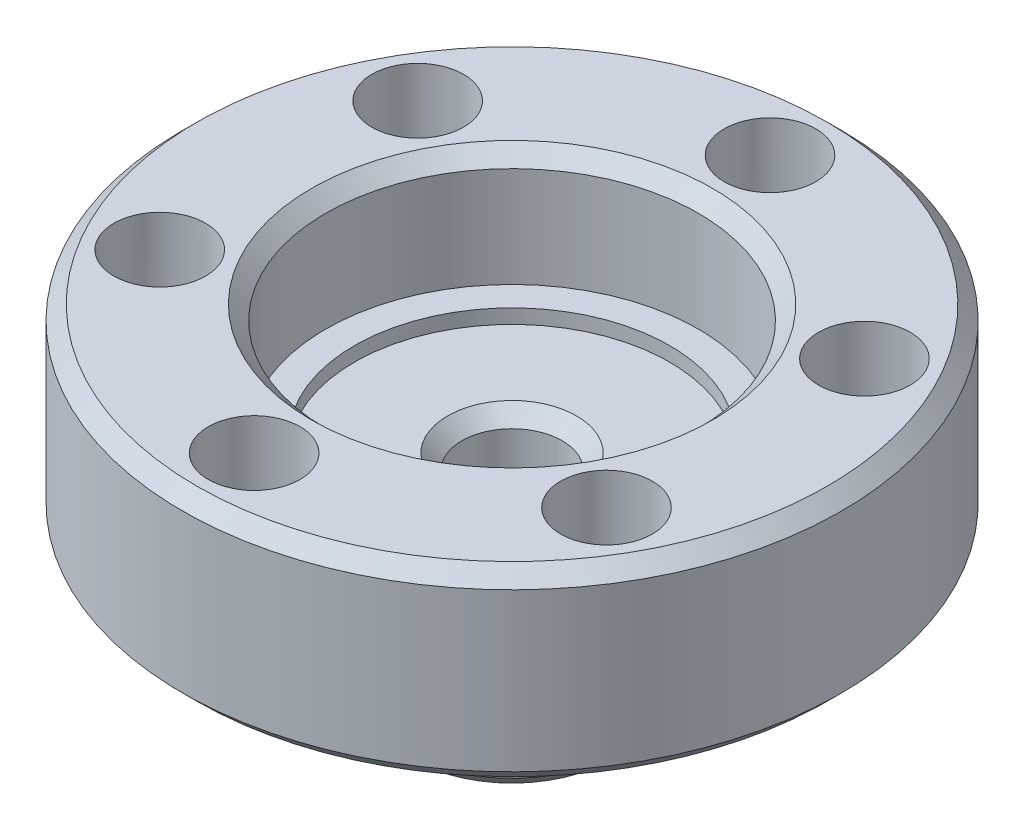
ISO-10303-21;
HEADER;
FILE_DESCRIPTION(('STEP AP214'),'2;1');
FILE_NAME('part.step','',(''),(''),'','','');
FILE_SCHEMA(('AUTOMOTIVE_DESIGN { 1 0 10303 214 1 1 1 1 }'));
ENDSEC;
DATA;
#1=APPLICATION_CONTEXT('core data for automotive mechanical design processes');
#2=APPLICATION_PROTOCOL_DEFINITION('international standard','automotive_design',2000,#1);
#3=PRODUCT_CONTEXT('',#1,'mechanical');
#4=PRODUCT('Part','Part','',(#3));
#5=PRODUCT_RELATED_PRODUCT_CATEGORY('part','',(#4));
#6=PRODUCT_DEFINITION_FORMATION('','',#4);
#7=PRODUCT_DEFINITION_CONTEXT('part definition',#1,'design');
#8=PRODUCT_DEFINITION('design','',#6,#7);
#9=PRODUCT_DEFINITION_SHAPE('','',#8);
#10=(LENGTH_UNIT() NAMED_UNIT(*) SI_UNIT(.MILLI.,.METRE.));
#11=(NAMED_UNIT(*) PLANE_ANGLE_UNIT() SI_UNIT($,.RADIAN.));
#12=(NAMED_UNIT(*) SI_UNIT($,.STERADIAN.) SOLID_ANGLE_UNIT());
#13=UNCERTAINTY_MEASURE_WITH_UNIT(LENGTH_MEASURE(1.E-05),#10,'distance_accuracy_value','');
#14=(GEOMETRIC_REPRESENTATION_CONTEXT(3) GLOBAL_UNCERTAINTY_ASSIGNED_CONTEXT((#13)) GLOBAL_UNIT_ASSIGNED_CONTEXT((#10,
#11,#12)) REPRESENTATION_CONTEXT('',''));
#15=CARTESIAN_POINT('',(0.,0.,0.));
#16=DIRECTION('',(0.,0.,1.));
#17=DIRECTION('',(1.,0.,0.));
#18=AXIS2_PLACEMENT_3D('',#15,#16,#17);
#19=CARTESIAN_POINT('',(7.79422863405996,-4.52548339959391,-4.49999999999998));
#20=DIRECTION('',(0.,1.,0.));
#21=DIRECTION('',(0.,0.,1.));
#22=AXIS2_PLACEMENT_3D('',#19,#20,#21);
#23=CYLINDRICAL_SURFACE('',#22,1.6);
#24=CARTESIAN_POINT('',(7.79422863405996,6.5,-4.49999999999998));
#25=DIRECTION('',(0.,1.,0.));
#26=DIRECTION('',(-0.86602540378444,0.,0.499999999999998));
#27=AXIS2_PLACEMENT_3D('',#24,#25,#26);
#28=CIRCLE('',#27,1.6);
#29=CARTESIAN_POINT('',(6.40858798800485,6.5,-3.69999999999998));
#30=VERTEX_POINT('',#29);
#31=EDGE_CURVE('E112',#30,#30,#28,.T.);
#32=ORIENTED_EDGE('',*,*,#31,.T.);
#33=EDGE_LOOP('',(#32));
#34=FACE_BOUND('',#33,.T.);
#35=CARTESIAN_POINT('',(7.79422863405996,4.,-4.49999999999998));
#36=DIRECTION('',(0.,-1.,0.));
#37=DIRECTION('',(0.,0.,-1.));
#38=AXIS2_PLACEMENT_3D('',#35,#36,#37);
#39=CIRCLE('',#38,1.6);
#40=CARTESIAN_POINT('',(7.79422863405996,4.,-6.09999999999998));
#41=VERTEX_POINT('',#40);
#42=EDGE_CURVE('E122',#41,#41,#39,.F.);
#43=ORIENTED_EDGE('',*,*,#42,.F.);
#44=EDGE_LOOP('',(#43));
#45=FACE_BOUND('',#44,.T.);
#46=ADVANCED_FACE('F45',(#34,#45),#23,.F.);
#47=CARTESIAN_POINT('',(7.79422863405993,-4.52548339959391,4.50000000000004));
#48=DIRECTION('',(0.,1.,0.));
#49=DIRECTION('',(0.,0.,1.));
#50=AXIS2_PLACEMENT_3D('',#47,#48,#49);
#51=CYLINDRICAL_SURFACE('',#50,1.6);
#52=CARTESIAN_POINT('',(7.79422863405993,6.5,4.50000000000004));
#53=DIRECTION('',(0.,1.,0.));
#54=DIRECTION('',(-0.866025403784436,0.,-0.500000000000004));
#55=AXIS2_PLACEMENT_3D('',#52,#53,#54);
#56=CIRCLE('',#55,1.6);
#57=CARTESIAN_POINT('',(6.40858798800483,6.5,3.70000000000003));
#58=VERTEX_POINT('',#57);
#59=EDGE_CURVE('E109',#58,#58,#56,.T.);
#60=ORIENTED_EDGE('',*,*,#59,.T.);
#61=EDGE_LOOP('',(#60));
#62=FACE_BOUND('',#61,.T.);
#63=CARTESIAN_POINT('',(7.79422863405993,4.,4.50000000000004));
#64=DIRECTION('',(0.,-1.,0.));
#65=DIRECTION('',(0.,0.,-1.));
#66=AXIS2_PLACEMENT_3D('',#63,#64,#65);
#67=CIRCLE('',#66,1.6);
#68=CARTESIAN_POINT('',(7.79422863405993,4.,2.90000000000004));
#69=VERTEX_POINT('',#68);
#70=EDGE_CURVE('E163',#69,#69,#67,.F.);
#71=ORIENTED_EDGE('',*,*,#70,.F.);
#72=EDGE_LOOP('',(#71));
#73=FACE_BOUND('',#72,.T.);
#74=ADVANCED_FACE('F220',(#62,#73),#51,.F.);
#75=CARTESIAN_POINT('',(0.,-4.52548339959391,9.));
#76=DIRECTION('',(0.,1.,0.));
#77=DIRECTION('',(0.,0.,1.));
#78=AXIS2_PLACEMENT_3D('',#75,#76,#77);
#79=CYLINDRICAL_SURFACE('',#78,1.6);
#80=CARTESIAN_POINT('',(0.,6.5,9.));
#81=DIRECTION('',(0.,1.,0.));
#82=DIRECTION('',(0.,0.,-1.));
#83=AXIS2_PLACEMENT_3D('',#80,#81,#82);
#84=CIRCLE('',#83,1.6);
#85=CARTESIAN_POINT('',(0.,6.5,7.4));
#86=VERTEX_POINT('',#85);
#87=EDGE_CURVE('E113',#86,#86,#84,.T.);
#88=ORIENTED_EDGE('',*,*,#87,.T.);
#89=EDGE_LOOP('',(#88));
#90=FACE_BOUND('',#89,.T.);
#91=CARTESIAN_POINT('',(0.,4.,9.));
#92=DIRECTION('',(0.,-1.,0.));
#93=DIRECTION('',(0.,0.,-1.));
#94=AXIS2_PLACEMENT_3D('',#91,#92,#93);
#95=CIRCLE('',#94,1.6);
#96=CARTESIAN_POINT('',(0.,4.,7.4));
#97=VERTEX_POINT('',#96);
#98=EDGE_CURVE('E160',#97,#97,#95,.F.);
#99=ORIENTED_EDGE('',*,*,#98,.F.);
#100=EDGE_LOOP('',(#99));
#101=FACE_BOUND('',#100,.T.);
#102=ADVANCED_FACE('F227',(#90,#101),#79,.F.);
#103=CARTESIAN_POINT('',(-7.79422863405999,-4.52548339959391,4.49999999999993));
#104=DIRECTION('',(0.,1.,0.));
#105=DIRECTION('',(0.,0.,1.));
#106=AXIS2_PLACEMENT_3D('',#103,#104,#105);
#107=CYLINDRICAL_SURFACE('',#106,1.6);
#108=CARTESIAN_POINT('',(-7.79422863405999,6.5,4.49999999999993));
#109=DIRECTION('',(0.,1.,0.));
#110=DIRECTION('',(0.866025403784443,0.,-0.499999999999992));
#111=AXIS2_PLACEMENT_3D('',#108,#109,#110);
#112=CIRCLE('',#111,1.6);
#113=CARTESIAN_POINT('',(-6.40858798800488,6.5,3.69999999999994));
#114=VERTEX_POINT('',#113);
#115=EDGE_CURVE('E116',#114,#114,#112,.T.);
#116=ORIENTED_EDGE('',*,*,#115,.T.);
#117=EDGE_LOOP('',(#116));
#118=FACE_BOUND('',#117,.T.);
#119=CARTESIAN_POINT('',(-7.79422863405999,4.,4.49999999999993));
#120=DIRECTION('',(0.,-1.,0.));
#121=DIRECTION('',(0.,0.,-1.));
#122=AXIS2_PLACEMENT_3D('',#119,#120,#121);
#123=CIRCLE('',#122,1.6);
#124=CARTESIAN_POINT('',(-7.79422863405999,4.,2.89999999999993));
#125=VERTEX_POINT('',#124);
#126=EDGE_CURVE('E157',#125,#125,#123,.F.);
#127=ORIENTED_EDGE('',*,*,#126,.F.);
#128=EDGE_LOOP('',(#127));
#129=FACE_BOUND('',#128,.T.);
#130=ADVANCED_FACE('F463',(#118,#129),#107,.F.);
#131=CARTESIAN_POINT('',(-7.79422863405989,-4.52548339959391,-4.50000000000009));
#132=DIRECTION('',(0.,1.,0.));
#133=DIRECTION('',(0.,0.,1.));
#134=AXIS2_PLACEMENT_3D('',#131,#132,#133);
#135=CYLINDRICAL_SURFACE('',#134,1.6);
#136=CARTESIAN_POINT('',(-7.79422863405989,6.5,-4.50000000000009));
#137=DIRECTION('',(0.,1.,0.));
#138=DIRECTION('',(0.866025403784433,0.,0.50000000000001));
#139=AXIS2_PLACEMENT_3D('',#136,#137,#138);
#140=CIRCLE('',#139,1.6);
#141=CARTESIAN_POINT('',(-6.4085879880048,6.5,-3.70000000000007));
#142=VERTEX_POINT('',#141);
#143=EDGE_CURVE('E119',#142,#142,#140,.T.);
#144=ORIENTED_EDGE('',*,*,#143,.T.);
#145=EDGE_LOOP('',(#144));
#146=FACE_BOUND('',#145,.T.);
#147=CARTESIAN_POINT('',(-7.79422863405989,4.,-4.50000000000009));
#148=DIRECTION('',(0.,-1.,0.));
#149=DIRECTION('',(0.,0.,-1.));
#150=AXIS2_PLACEMENT_3D('',#147,#148,#149);
#151=CIRCLE('',#150,1.6);
#152=CARTESIAN_POINT('',(-7.79422863405989,4.,-6.10000000000009));
#153=VERTEX_POINT('',#152);
#154=EDGE_CURVE('E105',#153,#153,#151,.F.);
#155=ORIENTED_EDGE('',*,*,#154,.F.);
#156=EDGE_LOOP('',(#155));
#157=FACE_BOUND('',#156,.T.);
#158=ADVANCED_FACE('F233',(#146,#157),#135,.F.);
#159=CARTESIAN_POINT('',(0.,-4.52548339959391,-9.));
#160=DIRECTION('',(0.,1.,0.));
#161=DIRECTION('',(0.,0.,1.));
#162=AXIS2_PLACEMENT_3D('',#159,#160,#161);
#163=CYLINDRICAL_SURFACE('',#162,1.6);
#164=CARTESIAN_POINT('',(0.,6.5,-9.));
#165=DIRECTION('',(0.,1.,0.));
#166=DIRECTION('',(0.,0.,1.));
#167=AXIS2_PLACEMENT_3D('',#164,#165,#166);
#168=CIRCLE('',#167,1.6);
#169=CARTESIAN_POINT('',(0.,6.5,-7.4));
#170=VERTEX_POINT('',#169);
#171=EDGE_CURVE('E131',#170,#170,#168,.T.);
#172=ORIENTED_EDGE('',*,*,#171,.T.);
#173=EDGE_LOOP('',(#172));
#174=FACE_BOUND('',#173,.T.);
#175=CARTESIAN_POINT('',(0.,4.,-9.));
#176=DIRECTION('',(0.,-1.,0.));
#177=DIRECTION('',(0.,0.,-1.));
#178=AXIS2_PLACEMENT_3D('',#175,#176,#177);
#179=CIRCLE('',#178,1.6);
#180=CARTESIAN_POINT('',(0.,4.,-10.6));
#181=VERTEX_POINT('',#180);
#182=EDGE_CURVE('E129',#181,#181,#179,.F.);
#183=ORIENTED_EDGE('',*,*,#182,.F.);
#184=EDGE_LOOP('',(#183));
#185=FACE_BOUND('',#184,.T.);
#186=ADVANCED_FACE('F244',(#174,#185),#163,.F.);
#187=CARTESIAN_POINT('',(0.,6.5,0.));
#188=DIRECTION('',(0.,-1.,0.));
#189=DIRECTION('',(0.,0.,-1.));
#190=AXIS2_PLACEMENT_3D('',#187,#188,#189);
#191=CYLINDRICAL_SURFACE('',#190,11.5);
#192=CARTESIAN_POINT('',(0.,0.500000000000025,0.));
#193=DIRECTION('',(0.,1.,0.));
#194=DIRECTION('',(0.,0.,1.));
#195=AXIS2_PLACEMENT_3D('',#192,#193,#194);
#196=CIRCLE('',#195,11.5);
#197=CARTESIAN_POINT('',(0.,0.500000000000025,-11.5));
#198=VERTEX_POINT('',#197);
#199=EDGE_CURVE('E188',#198,#198,#196,.T.);
#200=CARTESIAN_POINT('',(0.,6.00000000000003,0.));
#201=DIRECTION('',(0.,1.,0.));
#202=DIRECTION('',(0.,0.,1.));
#203=AXIS2_PLACEMENT_3D('',#200,#201,#202);
#204=CIRCLE('',#203,11.5);
#205=CARTESIAN_POINT('',(0.,6.00000000000003,-11.5));
#206=VERTEX_POINT('',#205);
#207=EDGE_CURVE('E185',#206,#206,#204,.F.);
#208=CARTESIAN_POINT('',(0.,0.500000000000025,-11.5));
#209=CARTESIAN_POINT('',(0.,0.557291666666691,-11.5));
#210=CARTESIAN_POINT('',(0.,0.614583333333358,-11.5));
#211=CARTESIAN_POINT('',(0.,0.729166666666691,-11.5));
#212=CARTESIAN_POINT('',(0.,0.786458333333358,-11.5));
#213=CARTESIAN_POINT('',(0.,0.901041666666692,-11.5));
#214=CARTESIAN_POINT('',(0.,0.958333333333358,-11.5));
#215=CARTESIAN_POINT('',(0.,1.07291666666669,-11.5));
#216=CARTESIAN_POINT('',(0.,1.13020833333336,-11.5));
#217=CARTESIAN_POINT('',(0.,1.24479166666669,-11.5));
#218=CARTESIAN_POINT('',(0.,1.30208333333336,-11.5));
#219=CARTESIAN_POINT('',(0.,1.41666666666669,-11.5));
#220=CARTESIAN_POINT('',(0.,1.47395833333336,-11.5));
#221=CARTESIAN_POINT('',(0.,1.58854166666669,-11.5));
#222=CARTESIAN_POINT('',(0.,1.64583333333336,-11.5));
#223=CARTESIAN_POINT('',(0.,1.76041666666669,-11.5));
#224=CARTESIAN_POINT('',(0.,1.81770833333336,-11.5));
#225=CARTESIAN_POINT('',(0.,1.93229166666669,-11.5));
#226=CARTESIAN_POINT('',(0.,1.98958333333336,-11.5));
#227=CARTESIAN_POINT('',(0.,2.10416666666669,-11.5));
#228=CARTESIAN_POINT('',(0.,2.16145833333336,-11.5));
#229=CARTESIAN_POINT('',(0.,2.27604166666669,-11.5));
#230=CARTESIAN_POINT('',(0.,2.33333333333336,-11.5));
#231=CARTESIAN_POINT('',(0.,2.44791666666669,-11.5));
#232=CARTESIAN_POINT('',(0.,2.50520833333336,-11.5));
#233=CARTESIAN_POINT('',(0.,2.61979166666669,-11.5));
#234=CARTESIAN_POINT('',(0.,2.67708333333336,-11.5));
#235=CARTESIAN_POINT('',(0.,2.79166666666669,-11.5));
#236=CARTESIAN_POINT('',(0.,2.84895833333336,-11.5));
#237=CARTESIAN_POINT('',(0.,2.96354166666669,-11.5));
#238=CARTESIAN_POINT('',(0.,3.02083333333336,-11.5));
#239=CARTESIAN_POINT('',(0.,3.13541666666669,-11.5));
#240=CARTESIAN_POINT('',(0.,3.19270833333336,-11.5));
#241=CARTESIAN_POINT('',(0.,3.30729166666669,-11.5));
#242=CARTESIAN_POINT('',(0.,3.36458333333336,-11.5));
#243=CARTESIAN_POINT('',(0.,3.47916666666669,-11.5));
#244=CARTESIAN_POINT('',(0.,3.53645833333336,-11.5));
#245=CARTESIAN_POINT('',(0.,3.65104166666669,-11.5));
#246=CARTESIAN_POINT('',(0.,3.70833333333336,-11.5));
#247=CARTESIAN_POINT('',(0.,3.82291666666669,-11.5));
#248=CARTESIAN_POINT('',(0.,3.88020833333336,-11.5));
#249=CARTESIAN_POINT('',(0.,3.99479166666669,-11.5));
#250=CARTESIAN_POINT('',(0.,4.05208333333336,-11.5));
#251=CARTESIAN_POINT('',(0.,4.16666666666669,-11.5));
#252=CARTESIAN_POINT('',(0.,4.22395833333336,-11.5));
#253=CARTESIAN_POINT('',(0.,4.33854166666669,-11.5));
#254=CARTESIAN_POINT('',(0.,4.39583333333336,-11.5));
#255=CARTESIAN_POINT('',(0.,4.51041666666669,-11.5));
#256=CARTESIAN_POINT('',(0.,4.56770833333336,-11.5));
#257=CARTESIAN_POINT('',(0.,4.68229166666669,-11.5));
#258=CARTESIAN_POINT('',(0.,4.73958333333336,-11.5));
#259=CARTESIAN_POINT('',(0.,4.85416666666669,-11.5));
#260=CARTESIAN_POINT('',(0.,4.91145833333336,-11.5));
#261=CARTESIAN_POINT('',(0.,5.02604166666669,-11.5));
#262=CARTESIAN_POINT('',(0.,5.08333333333336,-11.5));
#263=CARTESIAN_POINT('',(0.,5.19791666666669,-11.5));
#264=CARTESIAN_POINT('',(0.,5.25520833333336,-11.5));
#265=CARTESIAN_POINT('',(0.,5.36979166666669,-11.5));
#266=CARTESIAN_POINT('',(0.,5.42708333333336,-11.5));
#267=CARTESIAN_POINT('',(0.,5.54166666666669,-11.5));
#268=CARTESIAN_POINT('',(0.,5.59895833333336,-11.5));
#269=CARTESIAN_POINT('',(0.,5.71354166666669,-11.5));
#270=CARTESIAN_POINT('',(0.,5.77083333333336,-11.5));
#271=CARTESIAN_POINT('',(0.,5.88541666666669,-11.5));
#272=CARTESIAN_POINT('',(0.,5.94270833333336,-11.5));
#273=CARTESIAN_POINT('',(0.,6.00000000000003,-11.5));
#274=B_SPLINE_CURVE_WITH_KNOTS('',3,(#208,#209,#210,#211,#212,#213,#214,#215,#216,#217,#218,
#219,#220,#221,#222,#223,#224,#225,#226,#227,#228,#229,#230,#231,#232,#233,#234,#235,#236,#237,
#238,#239,#240,#241,#242,#243,#244,#245,#246,#247,#248,#249,#250,#251,#252,#253,#254,#255,#256,
#257,#258,#259,#260,#261,#262,#263,#264,#265,#266,#267,#268,#269,#270,#271,#272,#273),
.UNSPECIFIED.,.F.,.F.,(4,2,2,2,2,2,2,2,2,2,2,2,2,2,2,2,2,2,2,2,2,2,2,2,2,2,2,2,2,2,2,2,4),(0.,
0.171875,0.34375,0.515625,0.687500000000001,0.859375000000001,1.03125,1.203125,1.375,1.546875,
1.71875,1.890625,2.0625,2.234375,2.40625,2.578125,2.75,2.921875,3.09375,3.265625,3.4375,
3.609375,3.78125,3.953125,4.125,4.296875,4.46875,4.640625,4.8125,4.984375,5.15625,5.328125,5.5),.UNSPECIFIED.);
#275=EDGE_CURVE('BSEAM247',#198,#206,#274,.T.);
#276=ORIENTED_EDGE('',*,*,#199,.T.);
#277=ORIENTED_EDGE('',*,*,#207,.T.);
#278=ORIENTED_EDGE('',*,*,#275,.T.);
#279=ORIENTED_EDGE('',*,*,#275,.F.);
#280=EDGE_LOOP('',(#276,#278,#277,#279));
#281=FACE_BOUND('',#280,.T.);
#282=ADVANCED_FACE('F247',(#281),#191,.T.);
#283=CARTESIAN_POINT('',(0.,6.5,0.));
#284=DIRECTION('',(0.,1.,0.));
#285=DIRECTION('',(0.,0.,1.));
#286=AXIS2_PLACEMENT_3D('',#283,#284,#285);
#287=PLANE('',#286);
#288=CARTESIAN_POINT('',(0.,6.5,0.));
#289=DIRECTION('',(0.,1.,0.));
#290=DIRECTION('',(0.,0.,1.));
#291=AXIS2_PLACEMENT_3D('',#288,#289,#290);
#292=CIRCLE('',#291,11.);
#293=CARTESIAN_POINT('',(0.,6.5,11.));
#294=VERTEX_POINT('',#293);
#295=EDGE_CURVE('E54',#294,#294,#292,.T.);
#296=ORIENTED_EDGE('',*,*,#295,.T.);
#297=EDGE_LOOP('',(#296));
#298=FACE_BOUND('',#297,.T.);
#299=CARTESIAN_POINT('',(0.,6.5,0.));
#300=DIRECTION('',(0.,1.,0.));
#301=DIRECTION('',(0.,0.,1.));
#302=AXIS2_PLACEMENT_3D('',#299,#300,#301);
#303=CIRCLE('',#302,7.00000000000001);
#304=CARTESIAN_POINT('',(0.,6.5,7.00000000000001));
#305=VERTEX_POINT('',#304);
#306=EDGE_CURVE('E198',#305,#305,#303,.F.);
#307=ORIENTED_EDGE('',*,*,#306,.T.);
#308=EDGE_LOOP('',(#307));
#309=FACE_BOUND('',#308,.T.);
#310=ORIENTED_EDGE('',*,*,#143,.F.);
#311=EDGE_LOOP('',(#310));
#312=FACE_BOUND('',#311,.T.);
#313=ORIENTED_EDGE('',*,*,#115,.F.);
#314=EDGE_LOOP('',(#313));
#315=FACE_BOUND('',#314,.T.);
#316=ORIENTED_EDGE('',*,*,#87,.F.);
#317=EDGE_LOOP('',(#316));
#318=FACE_BOUND('',#317,.T.);
#319=ORIENTED_EDGE('',*,*,#59,.F.);
#320=EDGE_LOOP('',(#319));
#321=FACE_BOUND('',#320,.T.);
#322=ORIENTED_EDGE('',*,*,#31,.F.);
#323=EDGE_LOOP('',(#322));
#324=FACE_BOUND('',#323,.T.);
#325=ORIENTED_EDGE('',*,*,#171,.F.);
#326=EDGE_LOOP('',(#325));
#327=FACE_BOUND('',#326,.T.);
#328=ADVANCED_FACE('F203',(#298,#309,#312,#315,#318,#321,#324,#327),#287,.T.);
#329=CARTESIAN_POINT('',(0.,0.,0.));
#330=DIRECTION('',(0.,1.,0.));
#331=DIRECTION('',(0.,0.,1.));
#332=AXIS2_PLACEMENT_3D('',#329,#330,#331);
#333=PLANE('',#332);
#334=CARTESIAN_POINT('',(0.,0.,9.));
#335=DIRECTION('',(0.,-1.,0.));
#336=DIRECTION('',(0.,0.,1.));
#337=AXIS2_PLACEMENT_3D('',#334,#335,#336);
#338=CIRCLE('',#337,2.);
#339=CARTESIAN_POINT('',(0.,0.,11.));
#340=VERTEX_POINT('',#339);
#341=EDGE_CURVE('E616',#340,#340,#338,.T.);
#342=ORIENTED_EDGE('',*,*,#341,.F.);
#343=CARTESIAN_POINT('',(0.,0.,0.));
#344=DIRECTION('',(0.,1.,0.));
#345=DIRECTION('',(0.,0.,1.));
#346=AXIS2_PLACEMENT_3D('',#343,#344,#345);
#347=CIRCLE('',#346,11.);
#348=CARTESIAN_POINT('',(-9.52627944162887,0.,5.49999999999991));
#349=VERTEX_POINT('',#348);
#350=EDGE_CURVE('E92',#340,#349,#347,.F.);
#351=ORIENTED_EDGE('',*,*,#350,.T.);
#352=CARTESIAN_POINT('',(-7.79422863405999,0.,4.49999999999993));
#353=DIRECTION('',(0.,-1.,0.));
#354=DIRECTION('',(-0.866025403784443,0.,0.499999999999992));
#355=AXIS2_PLACEMENT_3D('',#352,#353,#354);
#356=CIRCLE('',#355,2.);
#357=EDGE_CURVE('E89',#349,#349,#356,.T.);
#358=ORIENTED_EDGE('',*,*,#357,.F.);
#359=CARTESIAN_POINT('',(0.,0.,0.));
#360=DIRECTION('',(0.,1.,0.));
#361=DIRECTION('',(0.,0.,1.));
#362=AXIS2_PLACEMENT_3D('',#359,#360,#361);
#363=CIRCLE('',#362,11.);
#364=CARTESIAN_POINT('',(-9.52627944162876,0.,-5.50000000000011));
#365=VERTEX_POINT('',#364);
#366=EDGE_CURVE('E81',#349,#365,#363,.F.);
#367=ORIENTED_EDGE('',*,*,#366,.T.);
#368=CARTESIAN_POINT('',(-7.79422863405989,0.,-4.50000000000009));
#369=DIRECTION('',(0.,-1.,0.));
#370=DIRECTION('',(-0.866025403784433,0.,-0.50000000000001));
#371=AXIS2_PLACEMENT_3D('',#368,#369,#370);
#372=CIRCLE('',#371,2.);
#373=EDGE_CURVE('E86',#365,#365,#372,.T.);
#374=ORIENTED_EDGE('',*,*,#373,.F.);
#375=CARTESIAN_POINT('',(0.,0.,0.));
#376=DIRECTION('',(0.,1.,0.));
#377=DIRECTION('',(0.,0.,1.));
#378=AXIS2_PLACEMENT_3D('',#375,#376,#377);
#379=CIRCLE('',#378,11.);
#380=CARTESIAN_POINT('',(0.,0.,-11.));
#381=VERTEX_POINT('',#380);
#382=EDGE_CURVE('E61',#365,#381,#379,.F.);
#383=ORIENTED_EDGE('',*,*,#382,.T.);
#384=CARTESIAN_POINT('',(0.,0.,-9.));
#385=DIRECTION('',(0.,-1.,0.));
#386=DIRECTION('',(0.,0.,-1.));
#387=AXIS2_PLACEMENT_3D('',#384,#385,#386);
#388=CIRCLE('',#387,2.);
#389=EDGE_CURVE('E125',#381,#381,#388,.T.);
#390=ORIENTED_EDGE('',*,*,#389,.F.);
#391=CARTESIAN_POINT('',(0.,0.,0.));
#392=DIRECTION('',(0.,1.,0.));
#393=DIRECTION('',(0.,0.,1.));
#394=AXIS2_PLACEMENT_3D('',#391,#392,#393);
#395=CIRCLE('',#394,11.);
#396=CARTESIAN_POINT('',(9.52627944162884,0.,-5.49999999999998));
#397=VERTEX_POINT('',#396);
#398=EDGE_CURVE('E67',#381,#397,#395,.F.);
#399=ORIENTED_EDGE('',*,*,#398,.T.);
#400=CARTESIAN_POINT('',(7.79422863405996,0.,-4.49999999999998));
#401=DIRECTION('',(0.,-1.,0.));
#402=DIRECTION('',(0.86602540378444,0.,-0.499999999999998));
#403=AXIS2_PLACEMENT_3D('',#400,#401,#402);
#404=CIRCLE('',#403,2.);
#405=EDGE_CURVE('E106',#397,#397,#404,.T.);
#406=ORIENTED_EDGE('',*,*,#405,.F.);
#407=CARTESIAN_POINT('',(0.,0.,0.));
#408=DIRECTION('',(0.,1.,0.));
#409=DIRECTION('',(0.,0.,1.));
#410=AXIS2_PLACEMENT_3D('',#407,#408,#409);
#411=CIRCLE('',#410,11.);
#412=CARTESIAN_POINT('',(9.5262794416288,0.,5.50000000000004));
#413=VERTEX_POINT('',#412);
#414=EDGE_CURVE('E193',#397,#413,#411,.F.);
#415=ORIENTED_EDGE('',*,*,#414,.T.);
#416=CARTESIAN_POINT('',(7.79422863405993,0.,4.50000000000004));
#417=DIRECTION('',(0.,-1.,0.));
#418=DIRECTION('',(0.866025403784436,0.,0.500000000000004));
#419=AXIS2_PLACEMENT_3D('',#416,#417,#418);
#420=CIRCLE('',#419,2.);
#421=EDGE_CURVE('E624',#413,#413,#420,.T.);
#422=ORIENTED_EDGE('',*,*,#421,.F.);
#423=CARTESIAN_POINT('',(0.,0.,0.));
#424=DIRECTION('',(0.,1.,0.));
#425=DIRECTION('',(0.,0.,1.));
#426=AXIS2_PLACEMENT_3D('',#423,#424,#425);
#427=CIRCLE('',#426,11.);
#428=EDGE_CURVE('E191',#413,#340,#427,.F.);
#429=ORIENTED_EDGE('',*,*,#428,.T.);
#430=EDGE_LOOP('',(#342,#351,#358,#367,#374,#383,#390,#399,#406,#415,#422,#429));
#431=FACE_BOUND('',#430,.T.);
#432=CARTESIAN_POINT('',(0.,0.,0.));
#433=DIRECTION('',(0.,-1.,0.));
#434=DIRECTION('',(0.,0.,-1.));
#435=AXIS2_PLACEMENT_3D('',#432,#433,#434);
#436=CIRCLE('',#435,5.);
#437=CARTESIAN_POINT('',(0.,0.,-5.));
#438=VERTEX_POINT('',#437);
#439=EDGE_CURVE('E148',#438,#438,#436,.T.);
#440=ORIENTED_EDGE('',*,*,#439,.F.);
#441=EDGE_LOOP('',(#440));
#442=FACE_BOUND('',#441,.T.);
#443=ADVANCED_FACE('F84',(#431,#442),#333,.F.);
#444=CARTESIAN_POINT('',(0.,-0.5,0.));
#445=DIRECTION('',(0.,1.,0.));
#446=DIRECTION('',(0.,0.,1.));
#447=AXIS2_PLACEMENT_3D('',#444,#445,#446);
#448=CYLINDRICAL_SURFACE('',#447,5.);
#449=CARTESIAN_POINT('',(0.,-0.5,0.));
#450=DIRECTION('',(0.,-1.,0.));
#451=DIRECTION('',(0.,0.,-1.));
#452=AXIS2_PLACEMENT_3D('',#449,#450,#451);
#453=CIRCLE('',#452,5.);
#454=CARTESIAN_POINT('',(0.,-0.5,-5.));
#455=VERTEX_POINT('',#454);
#456=EDGE_CURVE('E143',#455,#455,#453,.T.);
#457=ORIENTED_EDGE('',*,*,#456,.F.);
#458=EDGE_LOOP('',(#457));
#459=FACE_BOUND('',#458,.T.);
#460=ORIENTED_EDGE('',*,*,#439,.T.);
#461=EDGE_LOOP('',(#460));
#462=FACE_BOUND('',#461,.T.);
#463=ADVANCED_FACE('F279',(#459,#462),#448,.T.);
#464=CARTESIAN_POINT('',(0.,-0.5,0.));
#465=DIRECTION('',(0.,-1.,0.));
#466=DIRECTION('',(0.,0.,-1.));
#467=AXIS2_PLACEMENT_3D('',#464,#465,#466);
#468=PLANE('',#467);
#469=CARTESIAN_POINT('',(0.,-0.5,0.));
#470=DIRECTION('',(0.,-1.,0.));
#471=DIRECTION('',(0.,0.,-1.));
#472=AXIS2_PLACEMENT_3D('',#469,#470,#471);
#473=CIRCLE('',#472,4.);
#474=CARTESIAN_POINT('',(0.,-0.5,-4.));
#475=VERTEX_POINT('',#474);
#476=EDGE_CURVE('E144',#475,#475,#473,.T.);
#477=ORIENTED_EDGE('',*,*,#476,.F.);
#478=EDGE_LOOP('',(#477));
#479=FACE_BOUND('',#478,.T.);
#480=ORIENTED_EDGE('',*,*,#456,.T.);
#481=EDGE_LOOP('',(#480));
#482=FACE_BOUND('',#481,.T.);
#483=ADVANCED_FACE('F275',(#479,#482),#468,.T.);
#484=CARTESIAN_POINT('',(0.,-5.5,0.));
#485=DIRECTION('',(0.,1.,0.));
#486=DIRECTION('',(0.,0.,1.));
#487=AXIS2_PLACEMENT_3D('',#484,#485,#486);
#488=CYLINDRICAL_SURFACE('',#487,4.);
#489=CARTESIAN_POINT('',(0.,-5.00000000000001,0.));
#490=DIRECTION('',(0.,-1.,0.));
#491=DIRECTION('',(0.,0.,-1.));
#492=AXIS2_PLACEMENT_3D('',#489,#490,#491);
#493=CIRCLE('',#492,4.);
#494=CARTESIAN_POINT('',(0.,-5.00000000000001,-4.));
#495=VERTEX_POINT('',#494);
#496=EDGE_CURVE('E182',#495,#495,#493,.F.);
#497=ORIENTED_EDGE('',*,*,#496,.T.);
#498=EDGE_LOOP('',(#497));
#499=FACE_BOUND('',#498,.T.);
#500=ORIENTED_EDGE('',*,*,#476,.T.);
#501=EDGE_LOOP('',(#500));
#502=FACE_BOUND('',#501,.T.);
#503=ADVANCED_FACE('F271',(#499,#502),#488,.T.);
#504=CARTESIAN_POINT('',(0.,-5.5,0.));
#505=DIRECTION('',(0.,-1.,0.));
#506=DIRECTION('',(0.,0.,-1.));
#507=AXIS2_PLACEMENT_3D('',#504,#505,#506);
#508=PLANE('',#507);
#509=CARTESIAN_POINT('',(0.,-5.5,0.));
#510=DIRECTION('',(0.,-1.,0.));
#511=DIRECTION('',(0.,0.,-1.));
#512=AXIS2_PLACEMENT_3D('',#509,#510,#511);
#513=CIRCLE('',#512,2.24999999999999);
#514=CARTESIAN_POINT('',(0.,-5.5,-2.24999999999999));
#515=VERTEX_POINT('',#514);
#516=EDGE_CURVE('E179',#515,#515,#513,.F.);
#517=ORIENTED_EDGE('',*,*,#516,.T.);
#518=EDGE_LOOP('',(#517));
#519=FACE_BOUND('',#518,.T.);
#520=CARTESIAN_POINT('',(0.,-5.5,0.));
#521=DIRECTION('',(0.,-1.,0.));
#522=DIRECTION('',(0.,0.,-1.));
#523=AXIS2_PLACEMENT_3D('',#520,#521,#522);
#524=CIRCLE('',#523,3.50000000000001);
#525=CARTESIAN_POINT('',(0.,-5.5,-3.50000000000001));
#526=VERTEX_POINT('',#525);
#527=EDGE_CURVE('E176',#526,#526,#524,.T.);
#528=ORIENTED_EDGE('',*,*,#527,.T.);
#529=EDGE_LOOP('',(#528));
#530=FACE_BOUND('',#529,.T.);
#531=ADVANCED_FACE('F267',(#519,#530),#508,.T.);
#532=CARTESIAN_POINT('',(0.,2.5,0.));
#533=DIRECTION('',(0.,1.,0.));
#534=DIRECTION('',(0.,0.,1.));
#535=AXIS2_PLACEMENT_3D('',#532,#533,#534);
#536=CYLINDRICAL_SURFACE('',#535,6.5);
#537=CARTESIAN_POINT('',(0.,6.,0.));
#538=DIRECTION('',(0.,1.,0.));
#539=DIRECTION('',(0.,0.,1.));
#540=AXIS2_PLACEMENT_3D('',#537,#538,#539);
#541=CIRCLE('',#540,6.5);
#542=CARTESIAN_POINT('',(0.,6.,6.5));
#543=VERTEX_POINT('',#542);
#544=EDGE_CURVE('E11',#543,#543,#541,.T.);
#545=ORIENTED_EDGE('',*,*,#544,.T.);
#546=EDGE_LOOP('',(#545));
#547=FACE_BOUND('',#546,.T.);
#548=CARTESIAN_POINT('',(0.,2.5,0.));
#549=DIRECTION('',(0.,1.,0.));
#550=DIRECTION('',(0.,0.,1.));
#551=AXIS2_PLACEMENT_3D('',#548,#549,#550);
#552=CIRCLE('',#551,6.5);
#553=CARTESIAN_POINT('',(0.,2.5,6.5));
#554=VERTEX_POINT('',#553);
#555=EDGE_CURVE('E138',#554,#554,#552,.T.);
#556=ORIENTED_EDGE('',*,*,#555,.F.);
#557=EDGE_LOOP('',(#556));
#558=FACE_BOUND('',#557,.T.);
#559=ADVANCED_FACE('F263',(#547,#558),#536,.F.);
#560=CARTESIAN_POINT('',(0.,2.5,0.));
#561=DIRECTION('',(0.,1.,0.));
#562=DIRECTION('',(0.,0.,1.));
#563=AXIS2_PLACEMENT_3D('',#560,#561,#562);
#564=PLANE('',#563);
#565=CARTESIAN_POINT('',(0.,2.5,0.));
#566=DIRECTION('',(0.,1.,0.));
#567=DIRECTION('',(0.,0.,1.));
#568=AXIS2_PLACEMENT_3D('',#565,#566,#567);
#569=CIRCLE('',#568,5.5);
#570=CARTESIAN_POINT('',(0.,2.5,5.5));
#571=VERTEX_POINT('',#570);
#572=EDGE_CURVE('E134',#571,#571,#569,.T.);
#573=ORIENTED_EDGE('',*,*,#572,.F.);
#574=EDGE_LOOP('',(#573));
#575=FACE_BOUND('',#574,.T.);
#576=ORIENTED_EDGE('',*,*,#555,.T.);
#577=EDGE_LOOP('',(#576));
#578=FACE_BOUND('',#577,.T.);
#579=ADVANCED_FACE('F259',(#575,#578),#564,.T.);
#580=CARTESIAN_POINT('',(0.,2.,0.));
#581=DIRECTION('',(0.,1.,0.));
#582=DIRECTION('',(0.,0.,1.));
#583=AXIS2_PLACEMENT_3D('',#580,#581,#582);
#584=CYLINDRICAL_SURFACE('',#583,5.5);
#585=CARTESIAN_POINT('',(0.,2.,0.));
#586=DIRECTION('',(0.,1.,0.));
#587=DIRECTION('',(0.,0.,1.));
#588=AXIS2_PLACEMENT_3D('',#585,#586,#587);
#589=CIRCLE('',#588,5.5);
#590=CARTESIAN_POINT('',(0.,2.,5.5));
#591=VERTEX_POINT('',#590);
#592=EDGE_CURVE('E135',#591,#591,#589,.T.);
#593=ORIENTED_EDGE('',*,*,#592,.F.);
#594=EDGE_LOOP('',(#593));
#595=FACE_BOUND('',#594,.T.);
#596=ORIENTED_EDGE('',*,*,#572,.T.);
#597=EDGE_LOOP('',(#596));
#598=FACE_BOUND('',#597,.T.);
#599=ADVANCED_FACE('F255',(#595,#598),#584,.F.);
#600=CARTESIAN_POINT('',(0.,2.,0.));
#601=DIRECTION('',(0.,1.,0.));
#602=DIRECTION('',(0.,0.,1.));
#603=AXIS2_PLACEMENT_3D('',#600,#601,#602);
#604=PLANE('',#603);
#605=CARTESIAN_POINT('',(0.,2.,0.));
#606=DIRECTION('',(0.,1.,0.));
#607=DIRECTION('',(0.,0.,1.));
#608=AXIS2_PLACEMENT_3D('',#605,#606,#607);
#609=CIRCLE('',#608,2.25);
#610=CARTESIAN_POINT('',(0.,2.,2.25));
#611=VERTEX_POINT('',#610);
#612=EDGE_CURVE('E173',#611,#611,#609,.F.);
#613=ORIENTED_EDGE('',*,*,#612,.T.);
#614=EDGE_LOOP('',(#613));
#615=FACE_BOUND('',#614,.T.);
#616=ORIENTED_EDGE('',*,*,#592,.T.);
#617=EDGE_LOOP('',(#616));
#618=FACE_BOUND('',#617,.T.);
#619=ADVANCED_FACE('F251',(#615,#618),#604,.T.);
#620=CARTESIAN_POINT('',(0.,-10.4497474683058,0.));
#621=DIRECTION('',(0.,1.,0.));
#622=DIRECTION('',(0.,0.,1.));
#623=AXIS2_PLACEMENT_3D('',#620,#621,#622);
#624=CYLINDRICAL_SURFACE('',#623,1.75);
#625=CARTESIAN_POINT('',(0.,1.5,0.));
#626=DIRECTION('',(0.,1.,0.));
#627=DIRECTION('',(0.,0.,1.));
#628=AXIS2_PLACEMENT_3D('',#625,#626,#627);
#629=CIRCLE('',#628,1.75);
#630=CARTESIAN_POINT('',(0.,1.5,1.75));
#631=VERTEX_POINT('',#630);
#632=EDGE_CURVE('E170',#631,#631,#629,.T.);
#633=ORIENTED_EDGE('',*,*,#632,.T.);
#634=EDGE_LOOP('',(#633));
#635=FACE_BOUND('',#634,.T.);
#636=CARTESIAN_POINT('',(0.,-5.00000000000001,0.));
#637=DIRECTION('',(0.,-1.,0.));
#638=DIRECTION('',(0.,0.,-1.));
#639=AXIS2_PLACEMENT_3D('',#636,#637,#638);
#640=CIRCLE('',#639,1.75);
#641=CARTESIAN_POINT('',(0.,-5.00000000000001,-1.75));
#642=VERTEX_POINT('',#641);
#643=EDGE_CURVE('E147',#642,#642,#640,.T.);
#644=ORIENTED_EDGE('',*,*,#643,.T.);
#645=EDGE_LOOP('',(#644));
#646=FACE_BOUND('',#645,.T.);
#647=ADVANCED_FACE('F238',(#635,#646),#624,.F.);
#648=CARTESIAN_POINT('',(0.,4.,-9.));
#649=DIRECTION('',(0.,-1.,0.));
#650=DIRECTION('',(0.,0.,-1.));
#651=AXIS2_PLACEMENT_3D('',#648,#649,#650);
#652=PLANE('',#651);
#653=CARTESIAN_POINT('',(0.,4.,-9.));
#654=DIRECTION('',(0.,-1.,0.));
#655=DIRECTION('',(0.,0.,-1.));
#656=AXIS2_PLACEMENT_3D('',#653,#654,#655);
#657=CIRCLE('',#656,2.);
#658=CARTESIAN_POINT('',(0.,4.,-11.));
#659=VERTEX_POINT('',#658);
#660=EDGE_CURVE('E126',#659,#659,#657,.T.);
#661=ORIENTED_EDGE('',*,*,#660,.T.);
#662=EDGE_LOOP('',(#661));
#663=FACE_BOUND('',#662,.T.);
#664=ORIENTED_EDGE('',*,*,#182,.T.);
#665=EDGE_LOOP('',(#664));
#666=FACE_BOUND('',#665,.T.);
#667=ADVANCED_FACE('F235',(#663,#666),#652,.T.);
#668=CARTESIAN_POINT('',(0.,4.,-9.));
#669=DIRECTION('',(0.,-1.,0.));
#670=DIRECTION('',(0.,0.,-1.));
#671=AXIS2_PLACEMENT_3D('',#668,#669,#670);
#672=CYLINDRICAL_SURFACE('',#671,2.);
#673=ORIENTED_EDGE('',*,*,#660,.F.);
#674=EDGE_LOOP('',(#673));
#675=FACE_BOUND('',#674,.T.);
#676=ORIENTED_EDGE('',*,*,#389,.T.);
#677=EDGE_LOOP('',(#676));
#678=FACE_BOUND('',#677,.T.);
#679=ADVANCED_FACE('F237',(#675,#678),#672,.F.);
#680=CARTESIAN_POINT('',(-7.79422863405989,4.,-4.50000000000009));
#681=DIRECTION('',(0.,-1.,0.));
#682=DIRECTION('',(-0.866025403784433,0.,-0.50000000000001));
#683=AXIS2_PLACEMENT_3D('',#680,#681,#682);
#684=PLANE('',#683);
#685=CARTESIAN_POINT('',(-7.79422863405989,4.,-4.50000000000009));
#686=DIRECTION('',(0.,-1.,0.));
#687=DIRECTION('',(-0.866025403784433,0.,-0.50000000000001));
#688=AXIS2_PLACEMENT_3D('',#685,#686,#687);
#689=CIRCLE('',#688,2.);
#690=CARTESIAN_POINT('',(-9.52627944162876,4.,-5.50000000000011));
#691=VERTEX_POINT('',#690);
#692=EDGE_CURVE('E96',#691,#691,#689,.T.);
#693=ORIENTED_EDGE('',*,*,#692,.T.);
#694=EDGE_LOOP('',(#693));
#695=FACE_BOUND('',#694,.T.);
#696=ORIENTED_EDGE('',*,*,#154,.T.);
#697=EDGE_LOOP('',(#696));
#698=FACE_BOUND('',#697,.T.);
#699=ADVANCED_FACE('F242',(#695,#698),#684,.T.);
#700=CARTESIAN_POINT('',(-7.79422863405989,4.,-4.50000000000009));
#701=DIRECTION('',(0.,-1.,0.));
#702=DIRECTION('',(0.,0.,-1.));
#703=AXIS2_PLACEMENT_3D('',#700,#701,#702);
#704=CYLINDRICAL_SURFACE('',#703,2.);
#705=ORIENTED_EDGE('',*,*,#692,.F.);
#706=EDGE_LOOP('',(#705));
#707=FACE_BOUND('',#706,.T.);
#708=ORIENTED_EDGE('',*,*,#373,.T.);
#709=EDGE_LOOP('',(#708));
#710=FACE_BOUND('',#709,.T.);
#711=ADVANCED_FACE('F95',(#707,#710),#704,.F.);
#712=CARTESIAN_POINT('',(-7.79422863405999,4.,4.49999999999993));
#713=DIRECTION('',(0.,-1.,0.));
#714=DIRECTION('',(-0.866025403784443,0.,0.499999999999992));
#715=AXIS2_PLACEMENT_3D('',#712,#713,#714);
#716=PLANE('',#715);
#717=CARTESIAN_POINT('',(-7.79422863405999,4.,4.49999999999993));
#718=DIRECTION('',(0.,-1.,0.));
#719=DIRECTION('',(-0.866025403784443,0.,0.499999999999992));
#720=AXIS2_PLACEMENT_3D('',#717,#718,#719);
#721=CIRCLE('',#720,2.);
#722=CARTESIAN_POINT('',(-9.52627944162887,4.,5.49999999999991));
#723=VERTEX_POINT('',#722);
#724=EDGE_CURVE('E615',#723,#723,#721,.T.);
#725=ORIENTED_EDGE('',*,*,#724,.T.);
#726=EDGE_LOOP('',(#725));
#727=FACE_BOUND('',#726,.T.);
#728=ORIENTED_EDGE('',*,*,#126,.T.);
#729=EDGE_LOOP('',(#728));
#730=FACE_BOUND('',#729,.T.);
#731=ADVANCED_FACE('F420',(#727,#730),#716,.T.);
#732=CARTESIAN_POINT('',(-7.79422863405999,4.,4.49999999999993));
#733=DIRECTION('',(0.,-1.,0.));
#734=DIRECTION('',(0.,0.,-1.));
#735=AXIS2_PLACEMENT_3D('',#732,#733,#734);
#736=CYLINDRICAL_SURFACE('',#735,2.);
#737=ORIENTED_EDGE('',*,*,#724,.F.);
#738=EDGE_LOOP('',(#737));
#739=FACE_BOUND('',#738,.T.);
#740=ORIENTED_EDGE('',*,*,#357,.T.);
#741=EDGE_LOOP('',(#740));
#742=FACE_BOUND('',#741,.T.);
#743=ADVANCED_FACE('F411',(#739,#742),#736,.F.);
#744=CARTESIAN_POINT('',(0.,4.,9.));
#745=DIRECTION('',(0.,-1.,0.));
#746=DIRECTION('',(0.,0.,1.));
#747=AXIS2_PLACEMENT_3D('',#744,#745,#746);
#748=PLANE('',#747);
#749=CARTESIAN_POINT('',(0.,4.,9.));
#750=DIRECTION('',(0.,-1.,0.));
#751=DIRECTION('',(0.,0.,1.));
#752=AXIS2_PLACEMENT_3D('',#749,#750,#751);
#753=CIRCLE('',#752,2.);
#754=CARTESIAN_POINT('',(0.,4.,11.));
#755=VERTEX_POINT('',#754);
#756=EDGE_CURVE('E619',#755,#755,#753,.T.);
#757=ORIENTED_EDGE('',*,*,#756,.T.);
#758=EDGE_LOOP('',(#757));
#759=FACE_BOUND('',#758,.T.);
#760=ORIENTED_EDGE('',*,*,#98,.T.);
#761=EDGE_LOOP('',(#760));
#762=FACE_BOUND('',#761,.T.);
#763=ADVANCED_FACE('F402',(#759,#762),#748,.T.);
#764=CARTESIAN_POINT('',(0.,4.,9.));
#765=DIRECTION('',(0.,-1.,0.));
#766=DIRECTION('',(0.,0.,-1.));
#767=AXIS2_PLACEMENT_3D('',#764,#765,#766);
#768=CYLINDRICAL_SURFACE('',#767,2.);
#769=ORIENTED_EDGE('',*,*,#756,.F.);
#770=EDGE_LOOP('',(#769));
#771=FACE_BOUND('',#770,.T.);
#772=ORIENTED_EDGE('',*,*,#341,.T.);
#773=EDGE_LOOP('',(#772));
#774=FACE_BOUND('',#773,.T.);
#775=ADVANCED_FACE('F393',(#771,#774),#768,.F.);
#776=CARTESIAN_POINT('',(7.79422863405993,4.,4.50000000000004));
#777=DIRECTION('',(0.,-1.,0.));
#778=DIRECTION('',(0.866025403784436,0.,0.500000000000004));
#779=AXIS2_PLACEMENT_3D('',#776,#777,#778);
#780=PLANE('',#779);
#781=CARTESIAN_POINT('',(7.79422863405993,4.,4.50000000000004));
#782=DIRECTION('',(0.,-1.,0.));
#783=DIRECTION('',(0.866025403784436,0.,0.500000000000004));
#784=AXIS2_PLACEMENT_3D('',#781,#782,#783);
#785=CIRCLE('',#784,2.);
#786=CARTESIAN_POINT('',(9.5262794416288,4.,5.50000000000004));
#787=VERTEX_POINT('',#786);
#788=EDGE_CURVE('E108',#787,#787,#785,.T.);
#789=ORIENTED_EDGE('',*,*,#788,.T.);
#790=EDGE_LOOP('',(#789));
#791=FACE_BOUND('',#790,.T.);
#792=ORIENTED_EDGE('',*,*,#70,.T.);
#793=EDGE_LOOP('',(#792));
#794=FACE_BOUND('',#793,.T.);
#795=ADVANCED_FACE('F384',(#791,#794),#780,.T.);
#796=CARTESIAN_POINT('',(7.79422863405993,4.,4.50000000000004));
#797=DIRECTION('',(0.,-1.,0.));
#798=DIRECTION('',(0.,0.,-1.));
#799=AXIS2_PLACEMENT_3D('',#796,#797,#798);
#800=CYLINDRICAL_SURFACE('',#799,2.);
#801=ORIENTED_EDGE('',*,*,#788,.F.);
#802=EDGE_LOOP('',(#801));
#803=FACE_BOUND('',#802,.T.);
#804=ORIENTED_EDGE('',*,*,#421,.T.);
#805=EDGE_LOOP('',(#804));
#806=FACE_BOUND('',#805,.T.);
#807=ADVANCED_FACE('F375',(#803,#806),#800,.F.);
#808=CARTESIAN_POINT('',(7.79422863405996,4.,-4.49999999999998));
#809=DIRECTION('',(0.,-1.,0.));
#810=DIRECTION('',(0.86602540378444,0.,-0.499999999999998));
#811=AXIS2_PLACEMENT_3D('',#808,#809,#810);
#812=PLANE('',#811);
#813=CARTESIAN_POINT('',(7.79422863405996,4.,-4.49999999999998));
#814=DIRECTION('',(0.,-1.,0.));
#815=DIRECTION('',(0.86602540378444,0.,-0.499999999999998));
#816=AXIS2_PLACEMENT_3D('',#813,#814,#815);
#817=CIRCLE('',#816,2.);
#818=CARTESIAN_POINT('',(9.52627944162884,4.,-5.49999999999998));
#819=VERTEX_POINT('',#818);
#820=EDGE_CURVE('E102',#819,#819,#817,.T.);
#821=ORIENTED_EDGE('',*,*,#820,.T.);
#822=EDGE_LOOP('',(#821));
#823=FACE_BOUND('',#822,.T.);
#824=ORIENTED_EDGE('',*,*,#42,.T.);
#825=EDGE_LOOP('',(#824));
#826=FACE_BOUND('',#825,.T.);
#827=ADVANCED_FACE('F366',(#823,#826),#812,.T.);
#828=CARTESIAN_POINT('',(7.79422863405996,4.,-4.49999999999998));
#829=DIRECTION('',(0.,-1.,0.));
#830=DIRECTION('',(0.,0.,-1.));
#831=AXIS2_PLACEMENT_3D('',#828,#829,#830);
#832=CYLINDRICAL_SURFACE('',#831,2.);
#833=ORIENTED_EDGE('',*,*,#820,.F.);
#834=EDGE_LOOP('',(#833));
#835=FACE_BOUND('',#834,.T.);
#836=ORIENTED_EDGE('',*,*,#405,.T.);
#837=EDGE_LOOP('',(#836));
#838=FACE_BOUND('',#837,.T.);
#839=ADVANCED_FACE('F299',(#835,#838),#832,.F.);
#840=CARTESIAN_POINT('',(0.,1.5,0.));
#841=DIRECTION('',(0.,1.,0.));
#842=DIRECTION('',(0.,0.,1.));
#843=AXIS2_PLACEMENT_3D('',#840,#841,#842);
#844=CONICAL_SURFACE('',#843,1.75,0.785398163397452);
#845=ORIENTED_EDGE('',*,*,#612,.F.);
#846=EDGE_LOOP('',(#845));
#847=FACE_BOUND('',#846,.T.);
#848=ORIENTED_EDGE('',*,*,#632,.F.);
#849=EDGE_LOOP('',(#848));
#850=FACE_BOUND('',#849,.T.);
#851=ADVANCED_FACE('F292',(#847,#850),#844,.F.);
#852=CARTESIAN_POINT('',(0.,-5.5,0.));
#853=DIRECTION('',(0.,-1.,0.));
#854=DIRECTION('',(0.,0.,-1.));
#855=AXIS2_PLACEMENT_3D('',#852,#853,#854);
#856=CONICAL_SURFACE('',#855,2.24999999999999,0.785398163397447);
#857=ORIENTED_EDGE('',*,*,#643,.F.);
#858=EDGE_LOOP('',(#857));
#859=FACE_BOUND('',#858,.T.);
#860=ORIENTED_EDGE('',*,*,#516,.F.);
#861=EDGE_LOOP('',(#860));
#862=FACE_BOUND('',#861,.T.);
#863=ADVANCED_FACE('F298',(#859,#862),#856,.F.);
#864=CARTESIAN_POINT('',(0.,-5.5,0.));
#865=DIRECTION('',(0.,1.,0.));
#866=DIRECTION('',(0.,0.,1.));
#867=AXIS2_PLACEMENT_3D('',#864,#865,#866);
#868=CONICAL_SURFACE('',#867,3.50000000000001,0.785398163397445);
#869=ORIENTED_EDGE('',*,*,#496,.F.);
#870=EDGE_LOOP('',(#869));
#871=FACE_BOUND('',#870,.T.);
#872=ORIENTED_EDGE('',*,*,#527,.F.);
#873=EDGE_LOOP('',(#872));
#874=FACE_BOUND('',#873,.T.);
#875=ADVANCED_FACE('F215',(#871,#874),#868,.T.);
#876=CARTESIAN_POINT('',(0.,0.500000000000025,0.));
#877=DIRECTION('',(0.,1.,0.));
#878=DIRECTION('',(0.,0.,1.));
#879=AXIS2_PLACEMENT_3D('',#876,#877,#878);
#880=CONICAL_SURFACE('',#879,11.5,0.785398163397448);
#881=ORIENTED_EDGE('',*,*,#366,.F.);
#882=ORIENTED_EDGE('',*,*,#350,.F.);
#883=ORIENTED_EDGE('',*,*,#428,.F.);
#884=ORIENTED_EDGE('',*,*,#414,.F.);
#885=ORIENTED_EDGE('',*,*,#398,.F.);
#886=ORIENTED_EDGE('',*,*,#382,.F.);
#887=EDGE_LOOP('',(#881,#882,#883,#884,#885,#886));
#888=FACE_BOUND('',#887,.T.);
#889=ORIENTED_EDGE('',*,*,#199,.F.);
#890=EDGE_LOOP('',(#889));
#891=FACE_BOUND('',#890,.T.);
#892=ADVANCED_FACE('F208',(#888,#891),#880,.T.);
#893=CARTESIAN_POINT('',(0.,6.5,0.));
#894=DIRECTION('',(0.,-1.,0.));
#895=DIRECTION('',(0.,0.,-1.));
#896=AXIS2_PLACEMENT_3D('',#893,#894,#895);
#897=CONICAL_SURFACE('',#896,11.,0.785398163397447);
#898=ORIENTED_EDGE('',*,*,#207,.F.);
#899=EDGE_LOOP('',(#898));
#900=FACE_BOUND('',#899,.T.);
#901=ORIENTED_EDGE('',*,*,#295,.F.);
#902=EDGE_LOOP('',(#901));
#903=FACE_BOUND('',#902,.T.);
#904=ADVANCED_FACE('F206',(#900,#903),#897,.T.);
#905=CARTESIAN_POINT('',(0.,6.,0.));
#906=DIRECTION('',(0.,1.,0.));
#907=DIRECTION('',(0.,0.,1.));
#908=AXIS2_PLACEMENT_3D('',#905,#906,#907);
#909=CONICAL_SURFACE('',#908,6.5,0.785398163397454);
#910=ORIENTED_EDGE('',*,*,#306,.F.);
#911=EDGE_LOOP('',(#910));
#912=FACE_BOUND('',#911,.T.);
#913=ORIENTED_EDGE('',*,*,#544,.F.);
#914=EDGE_LOOP('',(#913));
#915=FACE_BOUND('',#914,.T.);
#916=ADVANCED_FACE('F48',(#912,#915),#909,.F.);
#917=CLOSED_SHELL('',(#46,#74,#102,#130,#158,#186,#282,#328,#443,#463,#483,#503,#531,#559,#579,
#599,#619,#647,#667,#679,#699,#711,#731,#743,#763,#775,#795,#807,#827,#839,#851,#863,#875,#892,
#904,#916));
#918=MANIFOLD_SOLID_BREP('B2',#917);
#919=ADVANCED_BREP_SHAPE_REPRESENTATION('',(#18,#918),#14);
#920=SHAPE_DEFINITION_REPRESENTATION(#9,#919);
ENDSEC;
END-ISO-10303-21;
